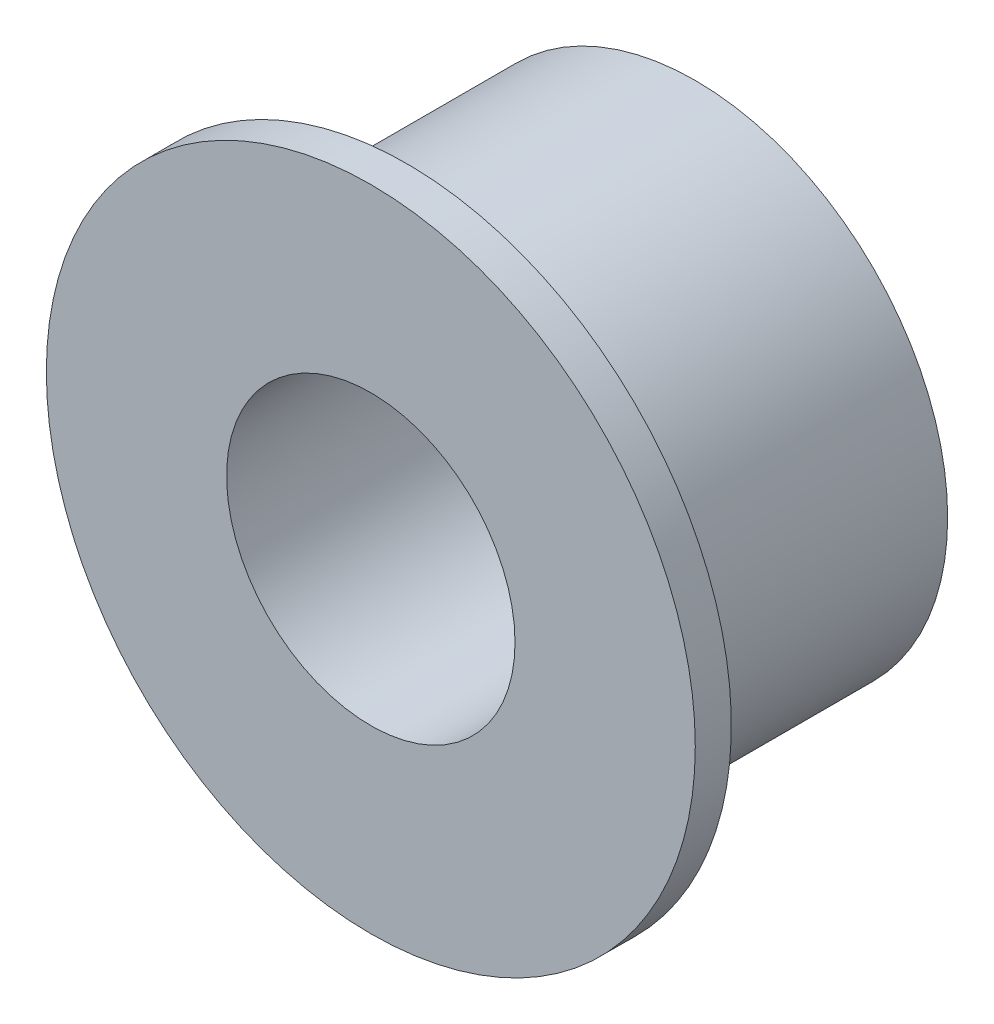
ISO-10303-21;
HEADER;
FILE_DESCRIPTION(('STEP AP214'),'2;1');
FILE_NAME('part.step','',(''),(''),'','','');
FILE_SCHEMA(('AUTOMOTIVE_DESIGN { 1 0 10303 214 1 1 1 1 }'));
ENDSEC;
DATA;
#1=APPLICATION_CONTEXT('core data for automotive mechanical design processes');
#2=APPLICATION_PROTOCOL_DEFINITION('international standard','automotive_design',2000,#1);
#3=PRODUCT_CONTEXT('',#1,'mechanical');
#4=PRODUCT('Part','Part','',(#3));
#5=PRODUCT_RELATED_PRODUCT_CATEGORY('part','',(#4));
#6=PRODUCT_DEFINITION_FORMATION('','',#4);
#7=PRODUCT_DEFINITION_CONTEXT('part definition',#1,'design');
#8=PRODUCT_DEFINITION('design','',#6,#7);
#9=PRODUCT_DEFINITION_SHAPE('','',#8);
#10=(LENGTH_UNIT() NAMED_UNIT(*) SI_UNIT(.MILLI.,.METRE.));
#11=(NAMED_UNIT(*) PLANE_ANGLE_UNIT() SI_UNIT($,.RADIAN.));
#12=(NAMED_UNIT(*) SI_UNIT($,.STERADIAN.) SOLID_ANGLE_UNIT());
#13=UNCERTAINTY_MEASURE_WITH_UNIT(LENGTH_MEASURE(1.E-05),#10,'distance_accuracy_value','');
#14=(GEOMETRIC_REPRESENTATION_CONTEXT(3) GLOBAL_UNCERTAINTY_ASSIGNED_CONTEXT((#13)) GLOBAL_UNIT_ASSIGNED_CONTEXT((#10,
#11,#12)) REPRESENTATION_CONTEXT('',''));
#15=CARTESIAN_POINT('',(0.,0.,0.));
#16=DIRECTION('',(0.,0.,1.));
#17=DIRECTION('',(1.,0.,0.));
#18=AXIS2_PLACEMENT_3D('',#15,#16,#17);
#19=CARTESIAN_POINT('',(0.,0.,9.));
#20=DIRECTION('',(0.,0.,-1.));
#21=DIRECTION('',(-1.,0.,0.));
#22=AXIS2_PLACEMENT_3D('',#19,#20,#21);
#23=CYLINDRICAL_SURFACE('',#22,9.);
#24=CARTESIAN_POINT('',(0.,0.,9.));
#25=DIRECTION('',(0.,0.,1.));
#26=DIRECTION('',(1.,0.,0.));
#27=AXIS2_PLACEMENT_3D('',#24,#25,#26);
#28=CIRCLE('',#27,9.);
#29=CARTESIAN_POINT('',(9.,0.,9.));
#30=VERTEX_POINT('',#29);
#31=EDGE_CURVE('E10',#30,#30,#28,.T.);
#32=ORIENTED_EDGE('',*,*,#31,.F.);
#33=EDGE_LOOP('',(#32));
#34=FACE_BOUND('',#33,.T.);
#35=CARTESIAN_POINT('',(0.,0.,8.));
#36=DIRECTION('',(0.,0.,-1.));
#37=DIRECTION('',(-1.,0.,0.));
#38=AXIS2_PLACEMENT_3D('',#35,#36,#37);
#39=CIRCLE('',#38,9.);
#40=CARTESIAN_POINT('',(-9.,0.,8.));
#41=VERTEX_POINT('',#40);
#42=EDGE_CURVE('E52',#41,#41,#39,.T.);
#43=ORIENTED_EDGE('',*,*,#42,.F.);
#44=EDGE_LOOP('',(#43));
#45=FACE_BOUND('',#44,.T.);
#46=ADVANCED_FACE('F37',(#34,#45),#23,.T.);
#47=CARTESIAN_POINT('',(0.,0.,9.));
#48=DIRECTION('',(0.,0.,1.));
#49=DIRECTION('',(1.,0.,0.));
#50=AXIS2_PLACEMENT_3D('',#47,#48,#49);
#51=PLANE('',#50);
#52=CARTESIAN_POINT('',(0.,0.,9.));
#53=DIRECTION('',(0.,0.,1.));
#54=DIRECTION('',(1.,0.,0.));
#55=AXIS2_PLACEMENT_3D('',#52,#53,#54);
#56=CIRCLE('',#55,4.);
#57=CARTESIAN_POINT('',(4.,0.,9.));
#58=VERTEX_POINT('',#57);
#59=EDGE_CURVE('E47',#58,#58,#56,.T.);
#60=ORIENTED_EDGE('',*,*,#59,.F.);
#61=EDGE_LOOP('',(#60));
#62=FACE_BOUND('',#61,.T.);
#63=ORIENTED_EDGE('',*,*,#31,.T.);
#64=EDGE_LOOP('',(#63));
#65=FACE_BOUND('',#64,.T.);
#66=ADVANCED_FACE('F74',(#62,#65),#51,.T.);
#67=CARTESIAN_POINT('',(0.,0.,2.));
#68=DIRECTION('',(0.,0.,1.));
#69=DIRECTION('',(1.,0.,0.));
#70=AXIS2_PLACEMENT_3D('',#67,#68,#69);
#71=CYLINDRICAL_SURFACE('',#70,4.);
#72=CARTESIAN_POINT('',(0.,0.,2.));
#73=DIRECTION('',(0.,0.,1.));
#74=DIRECTION('',(1.,0.,0.));
#75=AXIS2_PLACEMENT_3D('',#72,#73,#74);
#76=CIRCLE('',#75,4.);
#77=CARTESIAN_POINT('',(4.,0.,2.));
#78=VERTEX_POINT('',#77);
#79=EDGE_CURVE('E43',#78,#78,#76,.T.);
#80=ORIENTED_EDGE('',*,*,#79,.F.);
#81=EDGE_LOOP('',(#80));
#82=FACE_BOUND('',#81,.T.);
#83=ORIENTED_EDGE('',*,*,#59,.T.);
#84=EDGE_LOOP('',(#83));
#85=FACE_BOUND('',#84,.T.);
#86=ADVANCED_FACE('F80',(#82,#85),#71,.F.);
#87=CARTESIAN_POINT('',(0.,0.,2.));
#88=DIRECTION('',(0.,0.,1.));
#89=DIRECTION('',(1.,0.,0.));
#90=AXIS2_PLACEMENT_3D('',#87,#88,#89);
#91=PLANE('',#90);
#92=ORIENTED_EDGE('',*,*,#79,.T.);
#93=EDGE_LOOP('',(#92));
#94=FACE_BOUND('',#93,.T.);
#95=ADVANCED_FACE('F69',(#94),#91,.T.);
#96=CARTESIAN_POINT('',(0.,0.,8.));
#97=DIRECTION('',(0.,0.,-1.));
#98=DIRECTION('',(-1.,0.,0.));
#99=AXIS2_PLACEMENT_3D('',#96,#97,#98);
#100=PLANE('',#99);
#101=CARTESIAN_POINT('',(0.,0.,8.));
#102=DIRECTION('',(0.,0.,-1.));
#103=DIRECTION('',(-1.,0.,0.));
#104=AXIS2_PLACEMENT_3D('',#101,#102,#103);
#105=CIRCLE('',#104,7.);
#106=CARTESIAN_POINT('',(-7.,0.,8.));
#107=VERTEX_POINT('',#106);
#108=EDGE_CURVE('E56',#107,#107,#105,.T.);
#109=ORIENTED_EDGE('',*,*,#108,.F.);
#110=EDGE_LOOP('',(#109));
#111=FACE_BOUND('',#110,.T.);
#112=ORIENTED_EDGE('',*,*,#42,.T.);
#113=EDGE_LOOP('',(#112));
#114=FACE_BOUND('',#113,.T.);
#115=ADVANCED_FACE('F66',(#111,#114),#100,.T.);
#116=CARTESIAN_POINT('',(0.,0.,8.));
#117=DIRECTION('',(0.,0.,-1.));
#118=DIRECTION('',(-1.,0.,0.));
#119=AXIS2_PLACEMENT_3D('',#116,#117,#118);
#120=CYLINDRICAL_SURFACE('',#119,7.);
#121=ORIENTED_EDGE('',*,*,#108,.T.);
#122=EDGE_LOOP('',(#121));
#123=FACE_BOUND('',#122,.T.);
#124=CARTESIAN_POINT('',(0.,0.,0.));
#125=DIRECTION('',(0.,0.,-1.));
#126=DIRECTION('',(-1.,0.,0.));
#127=AXIS2_PLACEMENT_3D('',#124,#125,#126);
#128=CIRCLE('',#127,7.);
#129=CARTESIAN_POINT('',(-7.,0.,0.));
#130=VERTEX_POINT('',#129);
#131=EDGE_CURVE('E57',#130,#130,#128,.T.);
#132=ORIENTED_EDGE('',*,*,#131,.F.);
#133=EDGE_LOOP('',(#132));
#134=FACE_BOUND('',#133,.T.);
#135=ADVANCED_FACE('F63',(#123,#134),#120,.T.);
#136=CARTESIAN_POINT('',(0.,0.,0.));
#137=DIRECTION('',(0.,0.,1.));
#138=DIRECTION('',(1.,0.,0.));
#139=AXIS2_PLACEMENT_3D('',#136,#137,#138);
#140=PLANE('',#139);
#141=ORIENTED_EDGE('',*,*,#131,.T.);
#142=EDGE_LOOP('',(#141));
#143=FACE_BOUND('',#142,.T.);
#144=ADVANCED_FACE('F90',(#143),#140,.F.);
#145=CLOSED_SHELL('',(#46,#66,#86,#95,#115,#135,#144));
#146=MANIFOLD_SOLID_BREP('B2',#145);
#147=ADVANCED_BREP_SHAPE_REPRESENTATION('',(#18,#146),#14);
#148=SHAPE_DEFINITION_REPRESENTATION(#9,#147);
ENDSEC;
END-ISO-10303-21;
